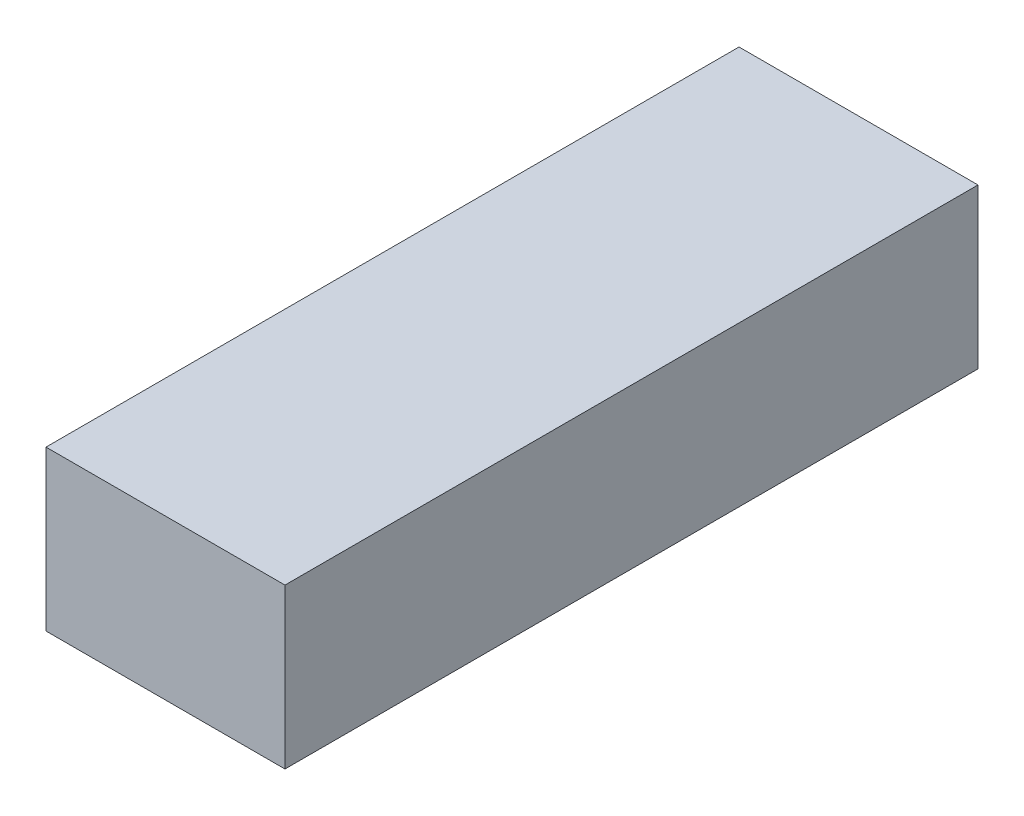
ISO-10303-21;
HEADER;
FILE_DESCRIPTION(('STEP AP214'),'2;1');
FILE_NAME('part.step','',(''),(''),'','','');
FILE_SCHEMA(('AUTOMOTIVE_DESIGN { 1 0 10303 214 1 1 1 1 }'));
ENDSEC;
DATA;
#1=APPLICATION_CONTEXT('core data for automotive mechanical design processes');
#2=APPLICATION_PROTOCOL_DEFINITION('international standard','automotive_design',2000,#1);
#3=PRODUCT_CONTEXT('',#1,'mechanical');
#4=PRODUCT('Part','Part','',(#3));
#5=PRODUCT_RELATED_PRODUCT_CATEGORY('part','',(#4));
#6=PRODUCT_DEFINITION_FORMATION('','',#4);
#7=PRODUCT_DEFINITION_CONTEXT('part definition',#1,'design');
#8=PRODUCT_DEFINITION('design','',#6,#7);
#9=PRODUCT_DEFINITION_SHAPE('','',#8);
#10=(LENGTH_UNIT() NAMED_UNIT(*) SI_UNIT(.MILLI.,.METRE.));
#11=(NAMED_UNIT(*) PLANE_ANGLE_UNIT() SI_UNIT($,.RADIAN.));
#12=(NAMED_UNIT(*) SI_UNIT($,.STERADIAN.) SOLID_ANGLE_UNIT());
#13=UNCERTAINTY_MEASURE_WITH_UNIT(LENGTH_MEASURE(1.E-05),#10,'distance_accuracy_value','');
#14=(GEOMETRIC_REPRESENTATION_CONTEXT(3) GLOBAL_UNCERTAINTY_ASSIGNED_CONTEXT((#13)) GLOBAL_UNIT_ASSIGNED_CONTEXT((#10,
#11,#12)) REPRESENTATION_CONTEXT('',''));
#15=CARTESIAN_POINT('',(0.,0.,0.));
#16=DIRECTION('',(0.,0.,1.));
#17=DIRECTION('',(1.,0.,0.));
#18=AXIS2_PLACEMENT_3D('',#15,#16,#17);
#19=CARTESIAN_POINT('',(15.,-10.,87.));
#20=DIRECTION('',(-1.,0.,0.));
#21=DIRECTION('',(0.,0.,1.));
#22=AXIS2_PLACEMENT_3D('',#19,#20,#21);
#23=PLANE('',#22);
#24=DIRECTION('',(0.,1.,0.));
#25=VECTOR('',#24,1.);
#26=CARTESIAN_POINT('',(15.,-10.,0.));
#27=LINE('',#26,#25);
#28=CARTESIAN_POINT('',(15.,-10.,0.));
#29=VERTEX_POINT('',#28);
#30=CARTESIAN_POINT('',(15.,10.,0.));
#31=VERTEX_POINT('',#30);
#32=EDGE_CURVE('E96',#29,#31,#27,.T.);
#33=ORIENTED_EDGE('',*,*,#32,.T.);
#34=DIRECTION('',(0.,0.,-1.));
#35=VECTOR('',#34,1.);
#36=CARTESIAN_POINT('',(15.,10.,87.));
#37=LINE('',#36,#35);
#38=CARTESIAN_POINT('',(15.,10.,87.));
#39=VERTEX_POINT('',#38);
#40=EDGE_CURVE('E11',#39,#31,#37,.T.);
#41=ORIENTED_EDGE('',*,*,#40,.F.);
#42=DIRECTION('',(0.,1.,0.));
#43=VECTOR('',#42,1.);
#44=CARTESIAN_POINT('',(15.,-10.,87.));
#45=LINE('',#44,#43);
#46=CARTESIAN_POINT('',(15.,-10.,87.));
#47=VERTEX_POINT('',#46);
#48=EDGE_CURVE('E84',#47,#39,#45,.T.);
#49=ORIENTED_EDGE('',*,*,#48,.F.);
#50=DIRECTION('',(0.,0.,-1.));
#51=VECTOR('',#50,1.);
#52=CARTESIAN_POINT('',(15.,-10.,87.));
#53=LINE('',#52,#51);
#54=EDGE_CURVE('E92',#47,#29,#53,.T.);
#55=ORIENTED_EDGE('',*,*,#54,.T.);
#56=EDGE_LOOP('',(#33,#41,#49,#55));
#57=FACE_BOUND('',#56,.T.);
#58=ADVANCED_FACE('F33',(#57),#23,.F.);
#59=CARTESIAN_POINT('',(-15.,10.,87.));
#60=DIRECTION('',(0.,-1.,0.));
#61=DIRECTION('',(0.,0.,-1.));
#62=AXIS2_PLACEMENT_3D('',#59,#60,#61);
#63=PLANE('',#62);
#64=DIRECTION('',(-1.,0.,0.));
#65=VECTOR('',#64,1.);
#66=CARTESIAN_POINT('',(-15.,10.,0.));
#67=LINE('',#66,#65);
#68=CARTESIAN_POINT('',(-15.,10.,0.));
#69=VERTEX_POINT('',#68);
#70=EDGE_CURVE('E88',#31,#69,#67,.T.);
#71=ORIENTED_EDGE('',*,*,#70,.T.);
#72=DIRECTION('',(0.,0.,-1.));
#73=VECTOR('',#72,1.);
#74=CARTESIAN_POINT('',(-15.,10.,87.));
#75=LINE('',#74,#73);
#76=CARTESIAN_POINT('',(-15.,10.,87.));
#77=VERTEX_POINT('',#76);
#78=EDGE_CURVE('E41',#77,#69,#75,.T.);
#79=ORIENTED_EDGE('',*,*,#78,.F.);
#80=DIRECTION('',(-1.,0.,0.));
#81=VECTOR('',#80,1.);
#82=CARTESIAN_POINT('',(-15.,10.,87.));
#83=LINE('',#82,#81);
#84=EDGE_CURVE('E79',#39,#77,#83,.T.);
#85=ORIENTED_EDGE('',*,*,#84,.F.);
#86=ORIENTED_EDGE('',*,*,#40,.T.);
#87=EDGE_LOOP('',(#71,#79,#85,#86));
#88=FACE_BOUND('',#87,.T.);
#89=ADVANCED_FACE('F87',(#88),#63,.F.);
#90=CARTESIAN_POINT('',(-15.,-10.,87.));
#91=DIRECTION('',(1.,0.,0.));
#92=DIRECTION('',(0.,0.,-1.));
#93=AXIS2_PLACEMENT_3D('',#90,#91,#92);
#94=PLANE('',#93);
#95=DIRECTION('',(0.,-1.,0.));
#96=VECTOR('',#95,1.);
#97=CARTESIAN_POINT('',(-15.,-10.,0.));
#98=LINE('',#97,#96);
#99=CARTESIAN_POINT('',(-15.,-10.,0.));
#100=VERTEX_POINT('',#99);
#101=EDGE_CURVE('E66',#69,#100,#98,.T.);
#102=ORIENTED_EDGE('',*,*,#101,.T.);
#103=DIRECTION('',(0.,0.,-1.));
#104=VECTOR('',#103,1.);
#105=CARTESIAN_POINT('',(-15.,-10.,87.));
#106=LINE('',#105,#104);
#107=CARTESIAN_POINT('',(-15.,-10.,87.));
#108=VERTEX_POINT('',#107);
#109=EDGE_CURVE('E89',#108,#100,#106,.T.);
#110=ORIENTED_EDGE('',*,*,#109,.F.);
#111=DIRECTION('',(0.,-1.,0.));
#112=VECTOR('',#111,1.);
#113=CARTESIAN_POINT('',(-15.,-10.,87.));
#114=LINE('',#113,#112);
#115=EDGE_CURVE('E82',#77,#108,#114,.T.);
#116=ORIENTED_EDGE('',*,*,#115,.F.);
#117=ORIENTED_EDGE('',*,*,#78,.T.);
#118=EDGE_LOOP('',(#102,#110,#116,#117));
#119=FACE_BOUND('',#118,.T.);
#120=ADVANCED_FACE('F90',(#119),#94,.F.);
#121=CARTESIAN_POINT('',(-15.,-10.,87.));
#122=DIRECTION('',(0.,1.,0.));
#123=DIRECTION('',(0.,0.,1.));
#124=AXIS2_PLACEMENT_3D('',#121,#122,#123);
#125=PLANE('',#124);
#126=DIRECTION('',(1.,0.,0.));
#127=VECTOR('',#126,1.);
#128=CARTESIAN_POINT('',(-15.,-10.,0.));
#129=LINE('',#128,#127);
#130=EDGE_CURVE('E72',#100,#29,#129,.T.);
#131=ORIENTED_EDGE('',*,*,#130,.T.);
#132=ORIENTED_EDGE('',*,*,#54,.F.);
#133=DIRECTION('',(1.,0.,0.));
#134=VECTOR('',#133,1.);
#135=CARTESIAN_POINT('',(-15.,-10.,87.));
#136=LINE('',#135,#134);
#137=EDGE_CURVE('E49',#108,#47,#136,.T.);
#138=ORIENTED_EDGE('',*,*,#137,.F.);
#139=ORIENTED_EDGE('',*,*,#109,.T.);
#140=EDGE_LOOP('',(#131,#132,#138,#139));
#141=FACE_BOUND('',#140,.T.);
#142=ADVANCED_FACE('F103',(#141),#125,.F.);
#143=CARTESIAN_POINT('',(0.,0.,87.));
#144=DIRECTION('',(0.,0.,-1.));
#145=DIRECTION('',(-1.,0.,0.));
#146=AXIS2_PLACEMENT_3D('',#143,#144,#145);
#147=PLANE('',#146);
#148=ORIENTED_EDGE('',*,*,#48,.T.);
#149=ORIENTED_EDGE('',*,*,#84,.T.);
#150=ORIENTED_EDGE('',*,*,#115,.T.);
#151=ORIENTED_EDGE('',*,*,#137,.T.);
#152=EDGE_LOOP('',(#148,#149,#150,#151));
#153=FACE_BOUND('',#152,.T.);
#154=ADVANCED_FACE('F80',(#153),#147,.F.);
#155=CARTESIAN_POINT('',(0.,0.,0.));
#156=DIRECTION('',(0.,0.,-1.));
#157=DIRECTION('',(-1.,0.,0.));
#158=AXIS2_PLACEMENT_3D('',#155,#156,#157);
#159=PLANE('',#158);
#160=ORIENTED_EDGE('',*,*,#32,.F.);
#161=ORIENTED_EDGE('',*,*,#130,.F.);
#162=ORIENTED_EDGE('',*,*,#101,.F.);
#163=ORIENTED_EDGE('',*,*,#70,.F.);
#164=EDGE_LOOP('',(#160,#161,#162,#163));
#165=FACE_BOUND('',#164,.T.);
#166=ADVANCED_FACE('F106',(#165),#159,.T.);
#167=CLOSED_SHELL('',(#58,#89,#120,#142,#154,#166));
#168=MANIFOLD_SOLID_BREP('B2',#167);
#169=ADVANCED_BREP_SHAPE_REPRESENTATION('',(#18,#168),#14);
#170=SHAPE_DEFINITION_REPRESENTATION(#9,#169);
ENDSEC;
END-ISO-10303-21;
